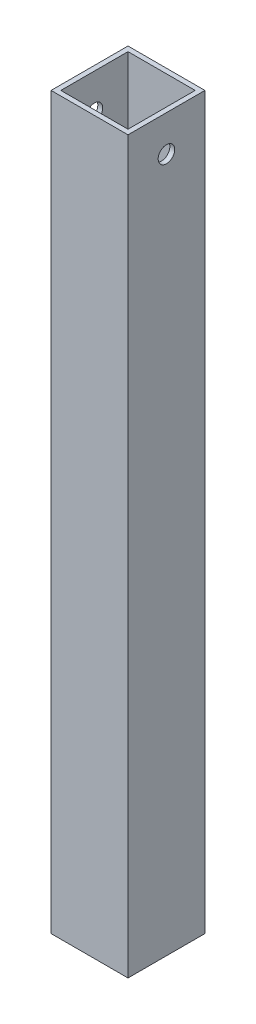
ISO-10303-21;
HEADER;
FILE_DESCRIPTION(('STEP AP214'),'2;1');
FILE_NAME('part.step','',(''),(''),'','','');
FILE_SCHEMA(('AUTOMOTIVE_DESIGN { 1 0 10303 214 1 1 1 1 }'));
ENDSEC;
DATA;
#1=APPLICATION_CONTEXT('core data for automotive mechanical design processes');
#2=APPLICATION_PROTOCOL_DEFINITION('international standard','automotive_design',2000,#1);
#3=PRODUCT_CONTEXT('',#1,'mechanical');
#4=PRODUCT('Part','Part','',(#3));
#5=PRODUCT_RELATED_PRODUCT_CATEGORY('part','',(#4));
#6=PRODUCT_DEFINITION_FORMATION('','',#4);
#7=PRODUCT_DEFINITION_CONTEXT('part definition',#1,'design');
#8=PRODUCT_DEFINITION('design','',#6,#7);
#9=PRODUCT_DEFINITION_SHAPE('','',#8);
#10=(LENGTH_UNIT() NAMED_UNIT(*) SI_UNIT(.MILLI.,.METRE.));
#11=(NAMED_UNIT(*) PLANE_ANGLE_UNIT() SI_UNIT($,.RADIAN.));
#12=(NAMED_UNIT(*) SI_UNIT($,.STERADIAN.) SOLID_ANGLE_UNIT());
#13=UNCERTAINTY_MEASURE_WITH_UNIT(LENGTH_MEASURE(1.E-05),#10,'distance_accuracy_value','');
#14=(GEOMETRIC_REPRESENTATION_CONTEXT(3) GLOBAL_UNCERTAINTY_ASSIGNED_CONTEXT((#13)) GLOBAL_UNIT_ASSIGNED_CONTEXT((#10,
#11,#12)) REPRESENTATION_CONTEXT('',''));
#15=CARTESIAN_POINT('',(0.,0.,0.));
#16=DIRECTION('',(0.,0.,1.));
#17=DIRECTION('',(1.,0.,0.));
#18=AXIS2_PLACEMENT_3D('',#15,#16,#17);
#19=CARTESIAN_POINT('',(0.,150.,0.));
#20=DIRECTION('',(0.,-1.,0.));
#21=DIRECTION('',(0.,0.,-1.));
#22=AXIS2_PLACEMENT_3D('',#19,#20,#21);
#23=PLANE('',#22);
#24=DIRECTION('',(0.,0.,-1.));
#25=VECTOR('',#24,1.);
#26=CARTESIAN_POINT('',(7.9,150.,7.9));
#27=LINE('',#26,#25);
#28=CARTESIAN_POINT('',(7.9,150.,7.9));
#29=VERTEX_POINT('',#28);
#30=CARTESIAN_POINT('',(7.9,150.,-7.9));
#31=VERTEX_POINT('',#30);
#32=EDGE_CURVE('E143',#29,#31,#27,.T.);
#33=ORIENTED_EDGE('',*,*,#32,.T.);
#34=DIRECTION('',(-1.,0.,0.));
#35=VECTOR('',#34,1.);
#36=CARTESIAN_POINT('',(-7.9,150.,-7.9));
#37=LINE('',#36,#35);
#38=CARTESIAN_POINT('',(-7.9,150.,-7.9));
#39=VERTEX_POINT('',#38);
#40=EDGE_CURVE('E146',#31,#39,#37,.T.);
#41=ORIENTED_EDGE('',*,*,#40,.T.);
#42=DIRECTION('',(0.,0.,1.));
#43=VECTOR('',#42,1.);
#44=CARTESIAN_POINT('',(-7.9,150.,7.9));
#45=LINE('',#44,#43);
#46=CARTESIAN_POINT('',(-7.9,150.,7.9));
#47=VERTEX_POINT('',#46);
#48=EDGE_CURVE('E149',#39,#47,#45,.T.);
#49=ORIENTED_EDGE('',*,*,#48,.T.);
#50=DIRECTION('',(1.,0.,0.));
#51=VECTOR('',#50,1.);
#52=CARTESIAN_POINT('',(-7.9,150.,7.9));
#53=LINE('',#52,#51);
#54=EDGE_CURVE('E151',#47,#29,#53,.T.);
#55=ORIENTED_EDGE('',*,*,#54,.T.);
#56=EDGE_LOOP('',(#33,#41,#49,#55));
#57=FACE_BOUND('',#56,.T.);
#58=DIRECTION('',(1.,0.,0.));
#59=VECTOR('',#58,1.);
#60=CARTESIAN_POINT('',(-6.9,150.,6.9));
#61=LINE('',#60,#59);
#62=CARTESIAN_POINT('',(-6.9,150.,6.9));
#63=VERTEX_POINT('',#62);
#64=CARTESIAN_POINT('',(6.9,150.,6.9));
#65=VERTEX_POINT('',#64);
#66=EDGE_CURVE('E105',#63,#65,#61,.T.);
#67=ORIENTED_EDGE('',*,*,#66,.F.);
#68=DIRECTION('',(0.,0.,1.));
#69=VECTOR('',#68,1.);
#70=CARTESIAN_POINT('',(-6.9,150.,6.9));
#71=LINE('',#70,#69);
#72=CARTESIAN_POINT('',(-6.9,150.,-6.9));
#73=VERTEX_POINT('',#72);
#74=EDGE_CURVE('E127',#73,#63,#71,.T.);
#75=ORIENTED_EDGE('',*,*,#74,.F.);
#76=DIRECTION('',(-1.,0.,0.));
#77=VECTOR('',#76,1.);
#78=CARTESIAN_POINT('',(-6.9,150.,-6.9));
#79=LINE('',#78,#77);
#80=CARTESIAN_POINT('',(6.9,150.,-6.9));
#81=VERTEX_POINT('',#80);
#82=EDGE_CURVE('E125',#81,#73,#79,.T.);
#83=ORIENTED_EDGE('',*,*,#82,.F.);
#84=DIRECTION('',(0.,0.,-1.));
#85=VECTOR('',#84,1.);
#86=CARTESIAN_POINT('',(6.9,150.,6.9));
#87=LINE('',#86,#85);
#88=EDGE_CURVE('E113',#65,#81,#87,.T.);
#89=ORIENTED_EDGE('',*,*,#88,.F.);
#90=EDGE_LOOP('',(#67,#75,#83,#89));
#91=FACE_BOUND('',#90,.T.);
#92=ADVANCED_FACE('F39',(#57,#91),#23,.F.);
#93=CARTESIAN_POINT('',(0.,0.,0.));
#94=DIRECTION('',(0.,-1.,0.));
#95=DIRECTION('',(0.,0.,-1.));
#96=AXIS2_PLACEMENT_3D('',#93,#94,#95);
#97=PLANE('',#96);
#98=DIRECTION('',(0.,0.,-1.));
#99=VECTOR('',#98,1.);
#100=CARTESIAN_POINT('',(7.9,0.,7.9));
#101=LINE('',#100,#99);
#102=CARTESIAN_POINT('',(7.9,0.,7.9));
#103=VERTEX_POINT('',#102);
#104=CARTESIAN_POINT('',(7.9,0.,-7.9));
#105=VERTEX_POINT('',#104);
#106=EDGE_CURVE('E121',#103,#105,#101,.T.);
#107=ORIENTED_EDGE('',*,*,#106,.F.);
#108=DIRECTION('',(1.,0.,0.));
#109=VECTOR('',#108,1.);
#110=CARTESIAN_POINT('',(-7.9,0.,7.9));
#111=LINE('',#110,#109);
#112=CARTESIAN_POINT('',(-7.9,0.,7.9));
#113=VERTEX_POINT('',#112);
#114=EDGE_CURVE('E147',#113,#103,#111,.T.);
#115=ORIENTED_EDGE('',*,*,#114,.F.);
#116=DIRECTION('',(0.,0.,1.));
#117=VECTOR('',#116,1.);
#118=CARTESIAN_POINT('',(-7.9,0.,7.9));
#119=LINE('',#118,#117);
#120=CARTESIAN_POINT('',(-7.9,0.,-7.9));
#121=VERTEX_POINT('',#120);
#122=EDGE_CURVE('E158',#121,#113,#119,.T.);
#123=ORIENTED_EDGE('',*,*,#122,.F.);
#124=DIRECTION('',(-1.,0.,0.));
#125=VECTOR('',#124,1.);
#126=CARTESIAN_POINT('',(-7.9,0.,-7.9));
#127=LINE('',#126,#125);
#128=EDGE_CURVE('E156',#105,#121,#127,.T.);
#129=ORIENTED_EDGE('',*,*,#128,.F.);
#130=EDGE_LOOP('',(#107,#115,#123,#129));
#131=FACE_BOUND('',#130,.T.);
#132=DIRECTION('',(0.,0.,1.));
#133=VECTOR('',#132,1.);
#134=CARTESIAN_POINT('',(-6.9,0.,6.9));
#135=LINE('',#134,#133);
#136=CARTESIAN_POINT('',(-6.9,0.,-6.9));
#137=VERTEX_POINT('',#136);
#138=CARTESIAN_POINT('',(-6.9,0.,6.9));
#139=VERTEX_POINT('',#138);
#140=EDGE_CURVE('E114',#137,#139,#135,.T.);
#141=ORIENTED_EDGE('',*,*,#140,.T.);
#142=DIRECTION('',(1.,0.,0.));
#143=VECTOR('',#142,1.);
#144=CARTESIAN_POINT('',(-6.9,0.,6.9));
#145=LINE('',#144,#143);
#146=CARTESIAN_POINT('',(6.9,0.,6.9));
#147=VERTEX_POINT('',#146);
#148=EDGE_CURVE('E63',#139,#147,#145,.T.);
#149=ORIENTED_EDGE('',*,*,#148,.T.);
#150=DIRECTION('',(0.,0.,-1.));
#151=VECTOR('',#150,1.);
#152=CARTESIAN_POINT('',(6.9,0.,6.9));
#153=LINE('',#152,#151);
#154=CARTESIAN_POINT('',(6.9,0.,-6.9));
#155=VERTEX_POINT('',#154);
#156=EDGE_CURVE('E120',#147,#155,#153,.T.);
#157=ORIENTED_EDGE('',*,*,#156,.T.);
#158=DIRECTION('',(-1.,0.,0.));
#159=VECTOR('',#158,1.);
#160=CARTESIAN_POINT('',(-6.9,0.,-6.9));
#161=LINE('',#160,#159);
#162=EDGE_CURVE('E135',#155,#137,#161,.T.);
#163=ORIENTED_EDGE('',*,*,#162,.T.);
#164=EDGE_LOOP('',(#141,#149,#157,#163));
#165=FACE_BOUND('',#164,.T.);
#166=ADVANCED_FACE('F177',(#131,#165),#97,.T.);
#167=CARTESIAN_POINT('',(7.9,150.,7.9));
#168=DIRECTION('',(-1.,0.,0.));
#169=DIRECTION('',(0.,0.,1.));
#170=AXIS2_PLACEMENT_3D('',#167,#168,#169);
#171=PLANE('',#170);
#172=CARTESIAN_POINT('',(7.9,142.6,0.));
#173=DIRECTION('',(-1.,0.,0.));
#174=DIRECTION('',(0.,0.,1.));
#175=AXIS2_PLACEMENT_3D('',#172,#173,#174);
#176=CIRCLE('',#175,1.70000000000001);
#177=CARTESIAN_POINT('',(7.9,142.6,1.7));
#178=VERTEX_POINT('',#177);
#179=EDGE_CURVE('E239',#178,#178,#176,.T.);
#180=ORIENTED_EDGE('',*,*,#179,.T.);
#181=EDGE_LOOP('',(#180));
#182=FACE_BOUND('',#181,.T.);
#183=ORIENTED_EDGE('',*,*,#106,.T.);
#184=DIRECTION('',(0.,-1.,0.));
#185=VECTOR('',#184,1.);
#186=CARTESIAN_POINT('',(7.9,150.,-7.9));
#187=LINE('',#186,#185);
#188=EDGE_CURVE('E11',#31,#105,#187,.T.);
#189=ORIENTED_EDGE('',*,*,#188,.F.);
#190=ORIENTED_EDGE('',*,*,#32,.F.);
#191=DIRECTION('',(0.,-1.,0.));
#192=VECTOR('',#191,1.);
#193=CARTESIAN_POINT('',(7.9,150.,7.9));
#194=LINE('',#193,#192);
#195=EDGE_CURVE('E153',#29,#103,#194,.T.);
#196=ORIENTED_EDGE('',*,*,#195,.T.);
#197=EDGE_LOOP('',(#183,#189,#190,#196));
#198=FACE_BOUND('',#197,.T.);
#199=ADVANCED_FACE('F41',(#182,#198),#171,.F.);
#200=CARTESIAN_POINT('',(-7.9,150.,-7.9));
#201=DIRECTION('',(0.,0.,1.));
#202=DIRECTION('',(1.,0.,0.));
#203=AXIS2_PLACEMENT_3D('',#200,#201,#202);
#204=PLANE('',#203);
#205=ORIENTED_EDGE('',*,*,#128,.T.);
#206=DIRECTION('',(0.,-1.,0.));
#207=VECTOR('',#206,1.);
#208=CARTESIAN_POINT('',(-7.9,150.,-7.9));
#209=LINE('',#208,#207);
#210=EDGE_CURVE('E48',#39,#121,#209,.T.);
#211=ORIENTED_EDGE('',*,*,#210,.F.);
#212=ORIENTED_EDGE('',*,*,#40,.F.);
#213=ORIENTED_EDGE('',*,*,#188,.T.);
#214=EDGE_LOOP('',(#205,#211,#212,#213));
#215=FACE_BOUND('',#214,.T.);
#216=ADVANCED_FACE('F187',(#215),#204,.F.);
#217=CARTESIAN_POINT('',(-7.9,150.,7.9));
#218=DIRECTION('',(1.,0.,0.));
#219=DIRECTION('',(0.,0.,-1.));
#220=AXIS2_PLACEMENT_3D('',#217,#218,#219);
#221=PLANE('',#220);
#222=CARTESIAN_POINT('',(-7.9,142.6,0.));
#223=DIRECTION('',(-1.,0.,0.));
#224=DIRECTION('',(0.,0.,1.));
#225=AXIS2_PLACEMENT_3D('',#222,#223,#224);
#226=CIRCLE('',#225,1.70000000000001);
#227=CARTESIAN_POINT('',(-7.9,142.6,1.7));
#228=VERTEX_POINT('',#227);
#229=EDGE_CURVE('E238',#228,#228,#226,.T.);
#230=ORIENTED_EDGE('',*,*,#229,.F.);
#231=EDGE_LOOP('',(#230));
#232=FACE_BOUND('',#231,.T.);
#233=ORIENTED_EDGE('',*,*,#122,.T.);
#234=DIRECTION('',(0.,-1.,0.));
#235=VECTOR('',#234,1.);
#236=CARTESIAN_POINT('',(-7.9,150.,7.9));
#237=LINE('',#236,#235);
#238=EDGE_CURVE('E163',#47,#113,#237,.T.);
#239=ORIENTED_EDGE('',*,*,#238,.F.);
#240=ORIENTED_EDGE('',*,*,#48,.F.);
#241=ORIENTED_EDGE('',*,*,#210,.T.);
#242=EDGE_LOOP('',(#233,#239,#240,#241));
#243=FACE_BOUND('',#242,.T.);
#244=ADVANCED_FACE('F171',(#232,#243),#221,.F.);
#245=CARTESIAN_POINT('',(-7.9,150.,7.9));
#246=DIRECTION('',(0.,0.,-1.));
#247=DIRECTION('',(-1.,0.,0.));
#248=AXIS2_PLACEMENT_3D('',#245,#246,#247);
#249=PLANE('',#248);
#250=ORIENTED_EDGE('',*,*,#114,.T.);
#251=ORIENTED_EDGE('',*,*,#195,.F.);
#252=ORIENTED_EDGE('',*,*,#54,.F.);
#253=ORIENTED_EDGE('',*,*,#238,.T.);
#254=EDGE_LOOP('',(#250,#251,#252,#253));
#255=FACE_BOUND('',#254,.T.);
#256=ADVANCED_FACE('F181',(#255),#249,.F.);
#257=CARTESIAN_POINT('',(-6.9,150.,6.9));
#258=DIRECTION('',(0.,0.,-1.));
#259=DIRECTION('',(-1.,0.,0.));
#260=AXIS2_PLACEMENT_3D('',#257,#258,#259);
#261=PLANE('',#260);
#262=ORIENTED_EDGE('',*,*,#148,.F.);
#263=DIRECTION('',(0.,-1.,0.));
#264=VECTOR('',#263,1.);
#265=CARTESIAN_POINT('',(-6.9,150.,6.9));
#266=LINE('',#265,#264);
#267=EDGE_CURVE('E109',#63,#139,#266,.T.);
#268=ORIENTED_EDGE('',*,*,#267,.F.);
#269=ORIENTED_EDGE('',*,*,#66,.T.);
#270=DIRECTION('',(0.,-1.,0.));
#271=VECTOR('',#270,1.);
#272=CARTESIAN_POINT('',(6.9,150.,6.9));
#273=LINE('',#272,#271);
#274=EDGE_CURVE('E108',#65,#147,#273,.T.);
#275=ORIENTED_EDGE('',*,*,#274,.T.);
#276=EDGE_LOOP('',(#262,#268,#269,#275));
#277=FACE_BOUND('',#276,.T.);
#278=ADVANCED_FACE('F107',(#277),#261,.T.);
#279=CARTESIAN_POINT('',(6.9,150.,6.9));
#280=DIRECTION('',(-1.,0.,0.));
#281=DIRECTION('',(0.,0.,1.));
#282=AXIS2_PLACEMENT_3D('',#279,#280,#281);
#283=PLANE('',#282);
#284=CARTESIAN_POINT('',(6.9,142.6,0.));
#285=DIRECTION('',(-1.,0.,0.));
#286=DIRECTION('',(0.,0.,1.));
#287=AXIS2_PLACEMENT_3D('',#284,#285,#286);
#288=CIRCLE('',#287,1.70000000000001);
#289=CARTESIAN_POINT('',(6.9,142.6,1.7));
#290=VERTEX_POINT('',#289);
#291=EDGE_CURVE('E133',#290,#290,#288,.T.);
#292=ORIENTED_EDGE('',*,*,#291,.F.);
#293=EDGE_LOOP('',(#292));
#294=FACE_BOUND('',#293,.T.);
#295=ORIENTED_EDGE('',*,*,#156,.F.);
#296=ORIENTED_EDGE('',*,*,#274,.F.);
#297=ORIENTED_EDGE('',*,*,#88,.T.);
#298=DIRECTION('',(0.,-1.,0.));
#299=VECTOR('',#298,1.);
#300=CARTESIAN_POINT('',(6.9,150.,-6.9));
#301=LINE('',#300,#299);
#302=EDGE_CURVE('E122',#81,#155,#301,.T.);
#303=ORIENTED_EDGE('',*,*,#302,.T.);
#304=EDGE_LOOP('',(#295,#296,#297,#303));
#305=FACE_BOUND('',#304,.T.);
#306=ADVANCED_FACE('F117',(#294,#305),#283,.T.);
#307=CARTESIAN_POINT('',(-6.9,150.,-6.9));
#308=DIRECTION('',(0.,0.,1.));
#309=DIRECTION('',(1.,0.,0.));
#310=AXIS2_PLACEMENT_3D('',#307,#308,#309);
#311=PLANE('',#310);
#312=ORIENTED_EDGE('',*,*,#162,.F.);
#313=ORIENTED_EDGE('',*,*,#302,.F.);
#314=ORIENTED_EDGE('',*,*,#82,.T.);
#315=DIRECTION('',(0.,-1.,0.));
#316=VECTOR('',#315,1.);
#317=CARTESIAN_POINT('',(-6.9,150.,-6.9));
#318=LINE('',#317,#316);
#319=EDGE_CURVE('E55',#73,#137,#318,.T.);
#320=ORIENTED_EDGE('',*,*,#319,.T.);
#321=EDGE_LOOP('',(#312,#313,#314,#320));
#322=FACE_BOUND('',#321,.T.);
#323=ADVANCED_FACE('F212',(#322),#311,.T.);
#324=CARTESIAN_POINT('',(-6.9,150.,6.9));
#325=DIRECTION('',(1.,0.,0.));
#326=DIRECTION('',(0.,0.,-1.));
#327=AXIS2_PLACEMENT_3D('',#324,#325,#326);
#328=PLANE('',#327);
#329=CARTESIAN_POINT('',(-6.9,142.6,0.));
#330=DIRECTION('',(1.,0.,0.));
#331=DIRECTION('',(0.,0.,-1.));
#332=AXIS2_PLACEMENT_3D('',#329,#330,#331);
#333=CIRCLE('',#332,1.70000000000001);
#334=CARTESIAN_POINT('',(-6.9,142.6,-1.70000000000002));
#335=VERTEX_POINT('',#334);
#336=EDGE_CURVE('E43',#335,#335,#333,.T.);
#337=ORIENTED_EDGE('',*,*,#336,.F.);
#338=EDGE_LOOP('',(#337));
#339=FACE_BOUND('',#338,.T.);
#340=ORIENTED_EDGE('',*,*,#140,.F.);
#341=ORIENTED_EDGE('',*,*,#319,.F.);
#342=ORIENTED_EDGE('',*,*,#74,.T.);
#343=ORIENTED_EDGE('',*,*,#267,.T.);
#344=EDGE_LOOP('',(#340,#341,#342,#343));
#345=FACE_BOUND('',#344,.T.);
#346=ADVANCED_FACE('F217',(#339,#345),#328,.T.);
#347=CARTESIAN_POINT('',(7.9,142.6,0.));
#348=DIRECTION('',(-1.,0.,0.));
#349=DIRECTION('',(0.,0.,1.));
#350=AXIS2_PLACEMENT_3D('',#347,#348,#349);
#351=CYLINDRICAL_SURFACE('',#350,1.70000000000001);
#352=ORIENTED_EDGE('',*,*,#336,.T.);
#353=EDGE_LOOP('',(#352));
#354=FACE_BOUND('',#353,.T.);
#355=ORIENTED_EDGE('',*,*,#229,.T.);
#356=EDGE_LOOP('',(#355));
#357=FACE_BOUND('',#356,.T.);
#358=ADVANCED_FACE('F224',(#354,#357),#351,.F.);
#359=ORIENTED_EDGE('',*,*,#291,.T.);
#360=EDGE_LOOP('',(#359));
#361=FACE_BOUND('',#360,.T.);
#362=ORIENTED_EDGE('',*,*,#179,.F.);
#363=EDGE_LOOP('',(#362));
#364=FACE_BOUND('',#363,.T.);
#365=ADVANCED_FACE('F227',(#361,#364),#351,.F.);
#366=CLOSED_SHELL('',(#92,#166,#199,#216,#244,#256,#278,#306,#323,#346,#358,#365));
#367=MANIFOLD_SOLID_BREP('B2',#366);
#368=ADVANCED_BREP_SHAPE_REPRESENTATION('',(#18,#367),#14);
#369=SHAPE_DEFINITION_REPRESENTATION(#9,#368);
ENDSEC;
END-ISO-10303-21;
